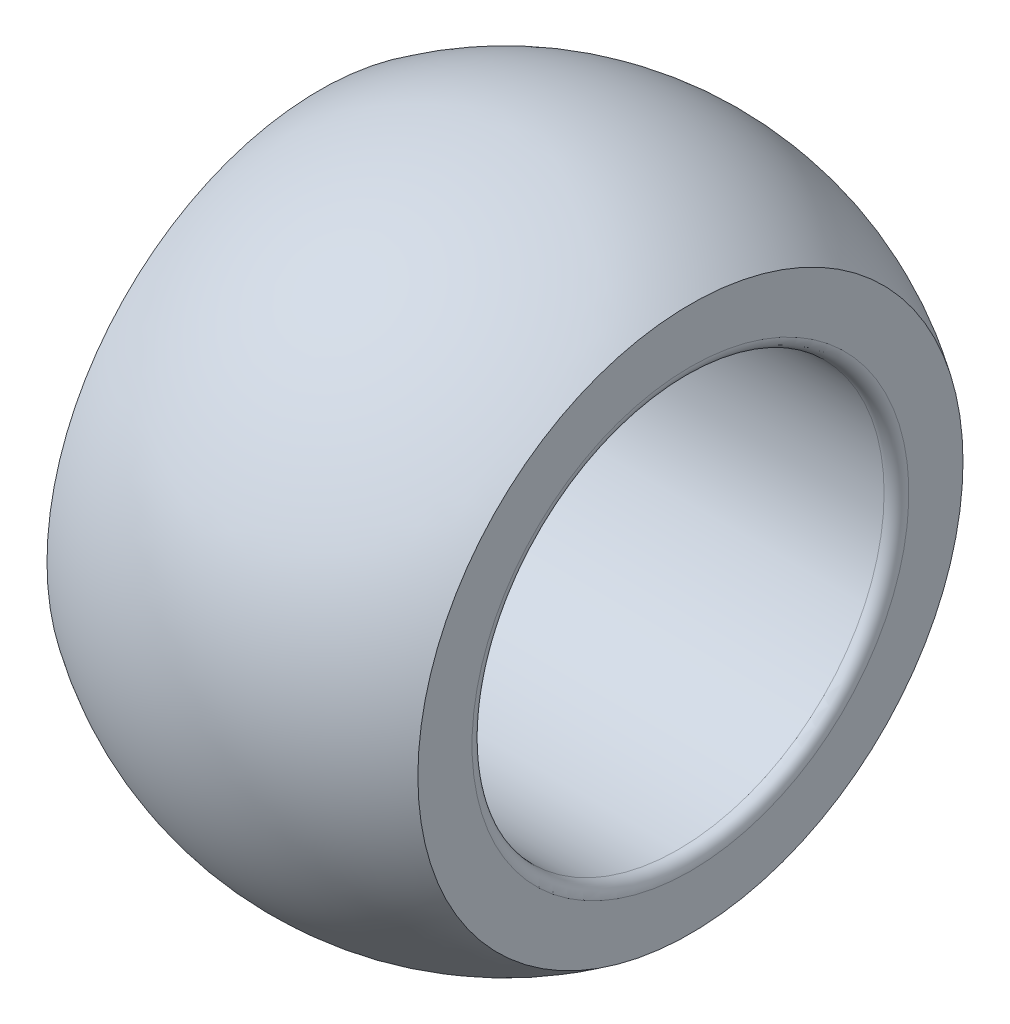
ISO-10303-21;
HEADER;
FILE_DESCRIPTION(('STEP AP214'),'2;1');
FILE_NAME('part.step','',(''),(''),'','','');
FILE_SCHEMA(('AUTOMOTIVE_DESIGN { 1 0 10303 214 1 1 1 1 }'));
ENDSEC;
DATA;
#1=APPLICATION_CONTEXT('core data for automotive mechanical design processes');
#2=APPLICATION_PROTOCOL_DEFINITION('international standard','automotive_design',2000,#1);
#3=PRODUCT_CONTEXT('',#1,'mechanical');
#4=PRODUCT('Part','Part','',(#3));
#5=PRODUCT_RELATED_PRODUCT_CATEGORY('part','',(#4));
#6=PRODUCT_DEFINITION_FORMATION('','',#4);
#7=PRODUCT_DEFINITION_CONTEXT('part definition',#1,'design');
#8=PRODUCT_DEFINITION('design','',#6,#7);
#9=PRODUCT_DEFINITION_SHAPE('','',#8);
#10=(LENGTH_UNIT() NAMED_UNIT(*) SI_UNIT(.MILLI.,.METRE.));
#11=(NAMED_UNIT(*) PLANE_ANGLE_UNIT() SI_UNIT($,.RADIAN.));
#12=(NAMED_UNIT(*) SI_UNIT($,.STERADIAN.) SOLID_ANGLE_UNIT());
#13=UNCERTAINTY_MEASURE_WITH_UNIT(LENGTH_MEASURE(1.E-05),#10,'distance_accuracy_value','');
#14=(GEOMETRIC_REPRESENTATION_CONTEXT(3) GLOBAL_UNCERTAINTY_ASSIGNED_CONTEXT((#13)) GLOBAL_UNIT_ASSIGNED_CONTEXT((#10,
#11,#12)) REPRESENTATION_CONTEXT('',''));
#15=CARTESIAN_POINT('',(0.,0.,0.));
#16=DIRECTION('',(0.,0.,1.));
#17=DIRECTION('',(1.,0.,0.));
#18=AXIS2_PLACEMENT_3D('',#15,#16,#17);
#19=CARTESIAN_POINT('',(0.,0.,0.));
#20=DIRECTION('',(0.,0.,1.));
#21=DIRECTION('',(1.,0.,0.));
#22=AXIS2_PLACEMENT_3D('',#19,#20,#21);
#23=SPHERICAL_SURFACE('',#22,8.);
#24=CARTESIAN_POINT('',(0.,0.,0.));
#25=DIRECTION('',(-1.,0.,0.));
#26=DIRECTION('',(0.,0.,-1.));
#27=AXIS2_PLACEMENT_3D('',#24,#25,#26);
#28=SPHERICAL_SURFACE('',#27,8.);
#29=CARTESIAN_POINT('',(4.5,0.,0.));
#30=DIRECTION('',(-1.,0.,0.));
#31=DIRECTION('',(0.,0.,-1.));
#32=AXIS2_PLACEMENT_3D('',#29,#30,#31);
#33=CIRCLE('',#32,6.61437827766148);
#34=CARTESIAN_POINT('',(4.5,0.,6.61437827766148));
#35=VERTEX_POINT('',#34);
#36=EDGE_CURVE('E20',#35,#35,#33,.T.);
#37=ORIENTED_EDGE('',*,*,#36,.T.);
#38=EDGE_LOOP('',(#37));
#39=FACE_BOUND('',#38,.T.);
#40=CARTESIAN_POINT('',(-4.5,0.,0.));
#41=DIRECTION('',(1.,0.,0.));
#42=DIRECTION('',(0.,0.,1.));
#43=AXIS2_PLACEMENT_3D('',#40,#41,#42);
#44=CIRCLE('',#43,6.61437827766148);
#45=CARTESIAN_POINT('',(-4.5,0.,-6.61437827766148));
#46=VERTEX_POINT('',#45);
#47=EDGE_CURVE('E11',#46,#46,#44,.T.);
#48=ORIENTED_EDGE('',*,*,#47,.T.);
#49=EDGE_LOOP('',(#48));
#50=FACE_BOUND('',#49,.T.);
#51=ADVANCED_FACE('F16',(#39,#50),#28,.T.);
#52=CARTESIAN_POINT('',(-4.5,7.4,0.));
#53=DIRECTION('',(1.,0.,0.));
#54=DIRECTION('',(0.,1.,0.));
#55=AXIS2_PLACEMENT_3D('',#52,#53,#54);
#56=PLANE('',#55);
#57=CARTESIAN_POINT('',(-4.5,0.,0.));
#58=DIRECTION('',(1.,0.,0.));
#59=DIRECTION('',(0.,1.,0.));
#60=AXIS2_PLACEMENT_3D('',#57,#58,#59);
#61=CIRCLE('',#60,5.3);
#62=CARTESIAN_POINT('',(-4.5,5.3,0.));
#63=VERTEX_POINT('',#62);
#64=EDGE_CURVE('E42',#63,#63,#61,.T.);
#65=ORIENTED_EDGE('',*,*,#64,.T.);
#66=EDGE_LOOP('',(#65));
#67=FACE_BOUND('',#66,.T.);
#68=ORIENTED_EDGE('',*,*,#47,.F.);
#69=EDGE_LOOP('',(#68));
#70=FACE_BOUND('',#69,.T.);
#71=ADVANCED_FACE('F73',(#67,#70),#56,.F.);
#72=CARTESIAN_POINT('',(4.5,7.4,0.));
#73=DIRECTION('',(-1.,0.,0.));
#74=DIRECTION('',(0.,-1.,0.));
#75=AXIS2_PLACEMENT_3D('',#72,#73,#74);
#76=PLANE('',#75);
#77=CARTESIAN_POINT('',(4.5,0.,0.));
#78=DIRECTION('',(1.,0.,0.));
#79=DIRECTION('',(0.,1.,0.));
#80=AXIS2_PLACEMENT_3D('',#77,#78,#79);
#81=CIRCLE('',#80,5.3);
#82=CARTESIAN_POINT('',(4.5,5.3,0.));
#83=VERTEX_POINT('',#82);
#84=EDGE_CURVE('E50',#83,#83,#81,.T.);
#85=ORIENTED_EDGE('',*,*,#84,.F.);
#86=EDGE_LOOP('',(#85));
#87=FACE_BOUND('',#86,.T.);
#88=ORIENTED_EDGE('',*,*,#36,.F.);
#89=EDGE_LOOP('',(#88));
#90=FACE_BOUND('',#89,.T.);
#91=ADVANCED_FACE('F69',(#87,#90),#76,.F.);
#92=CARTESIAN_POINT('',(4.2,0.,0.));
#93=DIRECTION('',(1.,0.,0.));
#94=DIRECTION('',(0.,0.,-1.));
#95=AXIS2_PLACEMENT_3D('',#92,#93,#94);
#96=TOROIDAL_SURFACE('',#95,5.3,0.3);
#97=CARTESIAN_POINT('',(4.2,0.,0.));
#98=DIRECTION('',(1.,0.,0.));
#99=DIRECTION('',(0.,1.,0.));
#100=AXIS2_PLACEMENT_3D('',#97,#98,#99);
#101=CIRCLE('',#100,5.);
#102=CARTESIAN_POINT('',(4.2,5.,0.));
#103=VERTEX_POINT('',#102);
#104=EDGE_CURVE('E46',#103,#103,#101,.T.);
#105=ORIENTED_EDGE('',*,*,#104,.F.);
#106=EDGE_LOOP('',(#105));
#107=FACE_BOUND('',#106,.T.);
#108=ORIENTED_EDGE('',*,*,#84,.T.);
#109=EDGE_LOOP('',(#108));
#110=FACE_BOUND('',#109,.T.);
#111=ADVANCED_FACE('F51',(#107,#110),#96,.T.);
#112=CARTESIAN_POINT('',(0.,0.,0.));
#113=DIRECTION('',(-1.,0.,0.));
#114=DIRECTION('',(0.,1.,0.));
#115=AXIS2_PLACEMENT_3D('',#112,#113,#114);
#116=CYLINDRICAL_SURFACE('',#115,5.);
#117=CARTESIAN_POINT('',(-4.2,0.,0.));
#118=DIRECTION('',(1.,0.,0.));
#119=DIRECTION('',(0.,1.,0.));
#120=AXIS2_PLACEMENT_3D('',#117,#118,#119);
#121=CIRCLE('',#120,5.);
#122=CARTESIAN_POINT('',(-4.2,5.,0.));
#123=VERTEX_POINT('',#122);
#124=EDGE_CURVE('E56',#123,#123,#121,.T.);
#125=ORIENTED_EDGE('',*,*,#124,.F.);
#126=EDGE_LOOP('',(#125));
#127=FACE_BOUND('',#126,.T.);
#128=ORIENTED_EDGE('',*,*,#104,.T.);
#129=EDGE_LOOP('',(#128));
#130=FACE_BOUND('',#129,.T.);
#131=ADVANCED_FACE('F60',(#127,#130),#116,.F.);
#132=CARTESIAN_POINT('',(-4.2,0.,0.));
#133=DIRECTION('',(1.,0.,0.));
#134=DIRECTION('',(0.,0.,-1.));
#135=AXIS2_PLACEMENT_3D('',#132,#133,#134);
#136=TOROIDAL_SURFACE('',#135,5.3,0.3);
#137=ORIENTED_EDGE('',*,*,#64,.F.);
#138=EDGE_LOOP('',(#137));
#139=FACE_BOUND('',#138,.T.);
#140=ORIENTED_EDGE('',*,*,#124,.T.);
#141=EDGE_LOOP('',(#140));
#142=FACE_BOUND('',#141,.T.);
#143=ADVANCED_FACE('F18',(#139,#142),#136,.T.);
#144=CLOSED_SHELL('',(#51,#71,#91,#111,#131,#143));
#145=MANIFOLD_SOLID_BREP('B1',#144);
#146=ADVANCED_BREP_SHAPE_REPRESENTATION('',(#18,#145),#14);
#147=SHAPE_DEFINITION_REPRESENTATION(#9,#146);
ENDSEC;
END-ISO-10303-21;
